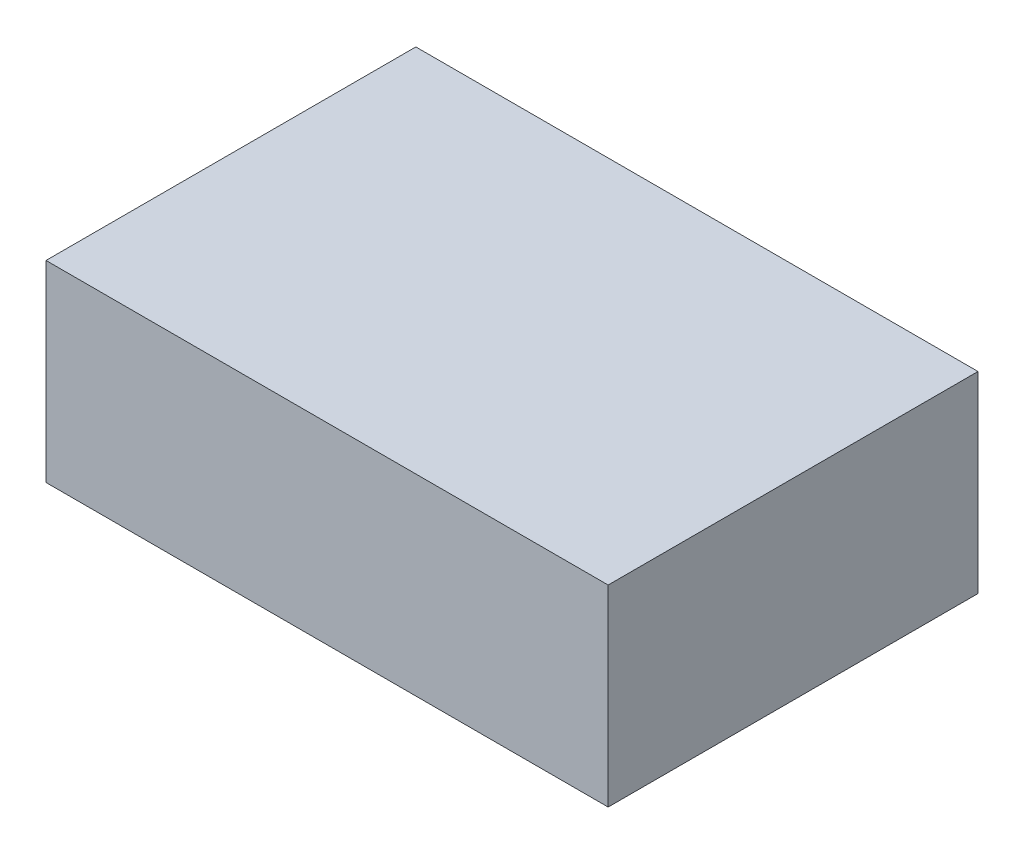
ISO-10303-21;
HEADER;
FILE_DESCRIPTION(('STEP AP214'),'2;1');
FILE_NAME('part.step','',(''),(''),'','','');
FILE_SCHEMA(('AUTOMOTIVE_DESIGN { 1 0 10303 214 1 1 1 1 }'));
ENDSEC;
DATA;
#1=APPLICATION_CONTEXT('core data for automotive mechanical design processes');
#2=APPLICATION_PROTOCOL_DEFINITION('international standard','automotive_design',2000,#1);
#3=PRODUCT_CONTEXT('',#1,'mechanical');
#4=PRODUCT('Part','Part','',(#3));
#5=PRODUCT_RELATED_PRODUCT_CATEGORY('part','',(#4));
#6=PRODUCT_DEFINITION_FORMATION('','',#4);
#7=PRODUCT_DEFINITION_CONTEXT('part definition',#1,'design');
#8=PRODUCT_DEFINITION('design','',#6,#7);
#9=PRODUCT_DEFINITION_SHAPE('','',#8);
#10=(LENGTH_UNIT() NAMED_UNIT(*) SI_UNIT(.MILLI.,.METRE.));
#11=(NAMED_UNIT(*) PLANE_ANGLE_UNIT() SI_UNIT($,.RADIAN.));
#12=(NAMED_UNIT(*) SI_UNIT($,.STERADIAN.) SOLID_ANGLE_UNIT());
#13=UNCERTAINTY_MEASURE_WITH_UNIT(LENGTH_MEASURE(1.E-05),#10,'distance_accuracy_value','');
#14=(GEOMETRIC_REPRESENTATION_CONTEXT(3) GLOBAL_UNCERTAINTY_ASSIGNED_CONTEXT((#13)) GLOBAL_UNIT_ASSIGNED_CONTEXT((#10,
#11,#12)) REPRESENTATION_CONTEXT('',''));
#15=CARTESIAN_POINT('',(0.,0.,0.));
#16=DIRECTION('',(0.,0.,1.));
#17=DIRECTION('',(1.,0.,0.));
#18=AXIS2_PLACEMENT_3D('',#15,#16,#17);
#19=CARTESIAN_POINT('',(-76.,52.,50.));
#20=DIRECTION('',(1.,0.,0.));
#21=DIRECTION('',(0.,0.,-1.));
#22=AXIS2_PLACEMENT_3D('',#19,#20,#21);
#23=PLANE('',#22);
#24=DIRECTION('',(0.,0.,1.));
#25=VECTOR('',#24,1.);
#26=CARTESIAN_POINT('',(-76.,0.,50.));
#27=LINE('',#26,#25);
#28=CARTESIAN_POINT('',(-76.,0.,-50.));
#29=VERTEX_POINT('',#28);
#30=CARTESIAN_POINT('',(-76.,0.,50.));
#31=VERTEX_POINT('',#30);
#32=EDGE_CURVE('E98',#29,#31,#27,.T.);
#33=ORIENTED_EDGE('',*,*,#32,.T.);
#34=DIRECTION('',(0.,-1.,0.));
#35=VECTOR('',#34,1.);
#36=CARTESIAN_POINT('',(-76.,52.,50.));
#37=LINE('',#36,#35);
#38=CARTESIAN_POINT('',(-76.,52.,50.));
#39=VERTEX_POINT('',#38);
#40=EDGE_CURVE('E11',#39,#31,#37,.T.);
#41=ORIENTED_EDGE('',*,*,#40,.F.);
#42=DIRECTION('',(0.,0.,1.));
#43=VECTOR('',#42,1.);
#44=CARTESIAN_POINT('',(-76.,52.,50.));
#45=LINE('',#44,#43);
#46=CARTESIAN_POINT('',(-76.,52.,-50.));
#47=VERTEX_POINT('',#46);
#48=EDGE_CURVE('E86',#47,#39,#45,.T.);
#49=ORIENTED_EDGE('',*,*,#48,.F.);
#50=DIRECTION('',(0.,-1.,0.));
#51=VECTOR('',#50,1.);
#52=CARTESIAN_POINT('',(-76.,52.,-50.));
#53=LINE('',#52,#51);
#54=EDGE_CURVE('E94',#47,#29,#53,.T.);
#55=ORIENTED_EDGE('',*,*,#54,.T.);
#56=EDGE_LOOP('',(#33,#41,#49,#55));
#57=FACE_BOUND('',#56,.T.);
#58=ADVANCED_FACE('F35',(#57),#23,.F.);
#59=CARTESIAN_POINT('',(-76.,52.,50.));
#60=DIRECTION('',(0.,0.,-1.));
#61=DIRECTION('',(-1.,0.,0.));
#62=AXIS2_PLACEMENT_3D('',#59,#60,#61);
#63=PLANE('',#62);
#64=DIRECTION('',(1.,0.,0.));
#65=VECTOR('',#64,1.);
#66=CARTESIAN_POINT('',(-76.,0.,50.));
#67=LINE('',#66,#65);
#68=CARTESIAN_POINT('',(76.,0.,50.));
#69=VERTEX_POINT('',#68);
#70=EDGE_CURVE('E90',#31,#69,#67,.T.);
#71=ORIENTED_EDGE('',*,*,#70,.T.);
#72=DIRECTION('',(0.,-1.,0.));
#73=VECTOR('',#72,1.);
#74=CARTESIAN_POINT('',(76.,52.,50.));
#75=LINE('',#74,#73);
#76=CARTESIAN_POINT('',(76.,52.,50.));
#77=VERTEX_POINT('',#76);
#78=EDGE_CURVE('E43',#77,#69,#75,.T.);
#79=ORIENTED_EDGE('',*,*,#78,.F.);
#80=DIRECTION('',(1.,0.,0.));
#81=VECTOR('',#80,1.);
#82=CARTESIAN_POINT('',(-76.,52.,50.));
#83=LINE('',#82,#81);
#84=EDGE_CURVE('E81',#39,#77,#83,.T.);
#85=ORIENTED_EDGE('',*,*,#84,.F.);
#86=ORIENTED_EDGE('',*,*,#40,.T.);
#87=EDGE_LOOP('',(#71,#79,#85,#86));
#88=FACE_BOUND('',#87,.T.);
#89=ADVANCED_FACE('F89',(#88),#63,.F.);
#90=CARTESIAN_POINT('',(76.,52.,50.));
#91=DIRECTION('',(-1.,0.,0.));
#92=DIRECTION('',(0.,0.,1.));
#93=AXIS2_PLACEMENT_3D('',#90,#91,#92);
#94=PLANE('',#93);
#95=DIRECTION('',(0.,0.,-1.));
#96=VECTOR('',#95,1.);
#97=CARTESIAN_POINT('',(76.,0.,50.));
#98=LINE('',#97,#96);
#99=CARTESIAN_POINT('',(76.,0.,-50.));
#100=VERTEX_POINT('',#99);
#101=EDGE_CURVE('E68',#69,#100,#98,.T.);
#102=ORIENTED_EDGE('',*,*,#101,.T.);
#103=DIRECTION('',(0.,-1.,0.));
#104=VECTOR('',#103,1.);
#105=CARTESIAN_POINT('',(76.,52.,-50.));
#106=LINE('',#105,#104);
#107=CARTESIAN_POINT('',(76.,52.,-50.));
#108=VERTEX_POINT('',#107);
#109=EDGE_CURVE('E91',#108,#100,#106,.T.);
#110=ORIENTED_EDGE('',*,*,#109,.F.);
#111=DIRECTION('',(0.,0.,-1.));
#112=VECTOR('',#111,1.);
#113=CARTESIAN_POINT('',(76.,52.,50.));
#114=LINE('',#113,#112);
#115=EDGE_CURVE('E84',#77,#108,#114,.T.);
#116=ORIENTED_EDGE('',*,*,#115,.F.);
#117=ORIENTED_EDGE('',*,*,#78,.T.);
#118=EDGE_LOOP('',(#102,#110,#116,#117));
#119=FACE_BOUND('',#118,.T.);
#120=ADVANCED_FACE('F92',(#119),#94,.F.);
#121=CARTESIAN_POINT('',(-76.,52.,-50.));
#122=DIRECTION('',(0.,0.,1.));
#123=DIRECTION('',(1.,0.,0.));
#124=AXIS2_PLACEMENT_3D('',#121,#122,#123);
#125=PLANE('',#124);
#126=DIRECTION('',(-1.,0.,0.));
#127=VECTOR('',#126,1.);
#128=CARTESIAN_POINT('',(-76.,0.,-50.));
#129=LINE('',#128,#127);
#130=EDGE_CURVE('E74',#100,#29,#129,.T.);
#131=ORIENTED_EDGE('',*,*,#130,.T.);
#132=ORIENTED_EDGE('',*,*,#54,.F.);
#133=DIRECTION('',(-1.,0.,0.));
#134=VECTOR('',#133,1.);
#135=CARTESIAN_POINT('',(-76.,52.,-50.));
#136=LINE('',#135,#134);
#137=EDGE_CURVE('E51',#108,#47,#136,.T.);
#138=ORIENTED_EDGE('',*,*,#137,.F.);
#139=ORIENTED_EDGE('',*,*,#109,.T.);
#140=EDGE_LOOP('',(#131,#132,#138,#139));
#141=FACE_BOUND('',#140,.T.);
#142=ADVANCED_FACE('F105',(#141),#125,.F.);
#143=CARTESIAN_POINT('',(0.,52.,0.));
#144=DIRECTION('',(0.,-1.,0.));
#145=DIRECTION('',(0.,0.,-1.));
#146=AXIS2_PLACEMENT_3D('',#143,#144,#145);
#147=PLANE('',#146);
#148=ORIENTED_EDGE('',*,*,#48,.T.);
#149=ORIENTED_EDGE('',*,*,#84,.T.);
#150=ORIENTED_EDGE('',*,*,#115,.T.);
#151=ORIENTED_EDGE('',*,*,#137,.T.);
#152=EDGE_LOOP('',(#148,#149,#150,#151));
#153=FACE_BOUND('',#152,.T.);
#154=ADVANCED_FACE('F82',(#153),#147,.F.);
#155=CARTESIAN_POINT('',(0.,0.,0.));
#156=DIRECTION('',(0.,-1.,0.));
#157=DIRECTION('',(0.,0.,-1.));
#158=AXIS2_PLACEMENT_3D('',#155,#156,#157);
#159=PLANE('',#158);
#160=ORIENTED_EDGE('',*,*,#32,.F.);
#161=ORIENTED_EDGE('',*,*,#130,.F.);
#162=ORIENTED_EDGE('',*,*,#101,.F.);
#163=ORIENTED_EDGE('',*,*,#70,.F.);
#164=EDGE_LOOP('',(#160,#161,#162,#163));
#165=FACE_BOUND('',#164,.T.);
#166=ADVANCED_FACE('F108',(#165),#159,.T.);
#167=CLOSED_SHELL('',(#58,#89,#120,#142,#154,#166));
#168=MANIFOLD_SOLID_BREP('B2',#167);
#169=ADVANCED_BREP_SHAPE_REPRESENTATION('',(#18,#168),#14);
#170=SHAPE_DEFINITION_REPRESENTATION(#9,#169);
ENDSEC;
END-ISO-10303-21;
